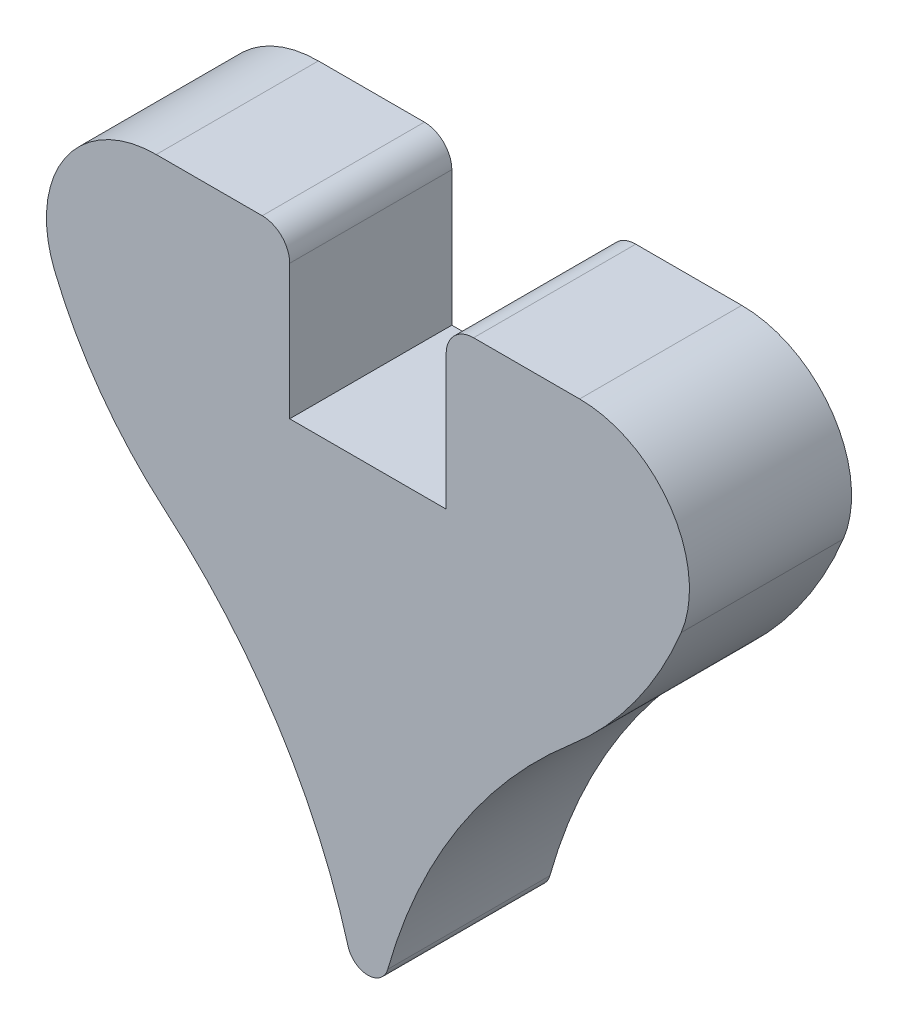
ISO-10303-21;
HEADER;
FILE_DESCRIPTION(('STEP AP214'),'2;1');
FILE_NAME('part.step','',(''),(''),'','','');
FILE_SCHEMA(('AUTOMOTIVE_DESIGN { 1 0 10303 214 1 1 1 1 }'));
ENDSEC;
DATA;
#1=APPLICATION_CONTEXT('core data for automotive mechanical design processes');
#2=APPLICATION_PROTOCOL_DEFINITION('international standard','automotive_design',2000,#1);
#3=PRODUCT_CONTEXT('',#1,'mechanical');
#4=PRODUCT('Part','Part','',(#3));
#5=PRODUCT_RELATED_PRODUCT_CATEGORY('part','',(#4));
#6=PRODUCT_DEFINITION_FORMATION('','',#4);
#7=PRODUCT_DEFINITION_CONTEXT('part definition',#1,'design');
#8=PRODUCT_DEFINITION('design','',#6,#7);
#9=PRODUCT_DEFINITION_SHAPE('','',#8);
#10=(LENGTH_UNIT() NAMED_UNIT(*) SI_UNIT(.MILLI.,.METRE.));
#11=(NAMED_UNIT(*) PLANE_ANGLE_UNIT() SI_UNIT($,.RADIAN.));
#12=(NAMED_UNIT(*) SI_UNIT($,.STERADIAN.) SOLID_ANGLE_UNIT());
#13=UNCERTAINTY_MEASURE_WITH_UNIT(LENGTH_MEASURE(1.E-05),#10,'distance_accuracy_value','');
#14=(GEOMETRIC_REPRESENTATION_CONTEXT(3) GLOBAL_UNCERTAINTY_ASSIGNED_CONTEXT((#13)) GLOBAL_UNIT_ASSIGNED_CONTEXT((#10,
#11,#12)) REPRESENTATION_CONTEXT('',''));
#15=CARTESIAN_POINT('',(0.,0.,0.));
#16=DIRECTION('',(0.,0.,1.));
#17=DIRECTION('',(1.,0.,0.));
#18=AXIS2_PLACEMENT_3D('',#15,#16,#17);
#19=CARTESIAN_POINT('',(-1.03061687101163,3.52972117310504,3.));
#20=DIRECTION('',(0.,0.,-1.));
#21=DIRECTION('',(-1.,0.,0.));
#22=AXIS2_PLACEMENT_3D('',#19,#20,#21);
#23=CYLINDRICAL_SURFACE('',#22,7.38061687101163);
#24=CARTESIAN_POINT('',(-1.03061687101163,3.52972117310504,0.));
#25=DIRECTION('',(0.,0.,1.));
#26=DIRECTION('',(1.,0.,0.));
#27=AXIS2_PLACEMENT_3D('',#24,#25,#26);
#28=CIRCLE('',#27,7.38061687101163);
#29=CARTESIAN_POINT('',(5.79662289840147,0.725741407199869,0.));
#30=VERTEX_POINT('',#29);
#31=CARTESIAN_POINT('',(3.75632103843788,-2.08799463029198,0.));
#32=VERTEX_POINT('',#31);
#33=EDGE_CURVE('E181',#30,#32,#28,.F.);
#34=ORIENTED_EDGE('',*,*,#33,.F.);
#35=DIRECTION('',(0.,0.,-1.));
#36=VECTOR('',#35,1.);
#37=CARTESIAN_POINT('',(5.79662289840147,0.725741407199869,3.));
#38=LINE('',#37,#36);
#39=CARTESIAN_POINT('',(5.79662289840147,0.725741407199869,3.));
#40=VERTEX_POINT('',#39);
#41=EDGE_CURVE('E234',#30,#40,#38,.F.);
#42=ORIENTED_EDGE('',*,*,#41,.T.);
#43=CARTESIAN_POINT('',(-1.03061687101163,3.52972117310504,3.));
#44=DIRECTION('',(0.,0.,1.));
#45=DIRECTION('',(1.,0.,0.));
#46=AXIS2_PLACEMENT_3D('',#43,#44,#45);
#47=CIRCLE('',#46,7.38061687101163);
#48=CARTESIAN_POINT('',(3.75632103843788,-2.08799463029198,3.));
#49=VERTEX_POINT('',#48);
#50=EDGE_CURVE('E201',#40,#49,#47,.F.);
#51=ORIENTED_EDGE('',*,*,#50,.T.);
#52=DIRECTION('',(0.,0.,-1.));
#53=VECTOR('',#52,1.);
#54=CARTESIAN_POINT('',(3.75632103843788,-2.08799463029198,3.));
#55=LINE('',#54,#53);
#56=EDGE_CURVE('E185',#49,#32,#55,.T.);
#57=ORIENTED_EDGE('',*,*,#56,.T.);
#58=EDGE_LOOP('',(#34,#42,#51,#57));
#59=FACE_BOUND('',#58,.T.);
#60=ADVANCED_FACE('F41',(#59),#23,.T.);
#61=CARTESIAN_POINT('',(0.,3.52972117310504,3.));
#62=DIRECTION('',(0.,1.,0.));
#63=DIRECTION('',(-1.,0.,0.));
#64=AXIS2_PLACEMENT_3D('',#61,#62,#63);
#65=PLANE('',#64);
#66=DIRECTION('',(1.,0.,0.));
#67=VECTOR('',#66,1.);
#68=CARTESIAN_POINT('',(0.,3.52972117310504,0.));
#69=LINE('',#68,#67);
#70=CARTESIAN_POINT('',(1.9555,3.52972117310504,0.));
#71=VERTEX_POINT('',#70);
#72=CARTESIAN_POINT('',(3.91697632496459,3.52972117310504,0.));
#73=VERTEX_POINT('',#72);
#74=EDGE_CURVE('E183',#71,#73,#69,.T.);
#75=ORIENTED_EDGE('',*,*,#74,.F.);
#76=DIRECTION('',(0.,0.,-1.));
#77=VECTOR('',#76,1.);
#78=CARTESIAN_POINT('',(1.9555,3.52972117310504,3.));
#79=LINE('',#78,#77);
#80=CARTESIAN_POINT('',(1.9555,3.52972117310504,3.));
#81=VERTEX_POINT('',#80);
#82=EDGE_CURVE('E241',#71,#81,#79,.F.);
#83=ORIENTED_EDGE('',*,*,#82,.T.);
#84=DIRECTION('',(1.,0.,0.));
#85=VECTOR('',#84,1.);
#86=CARTESIAN_POINT('',(0.,3.52972117310504,3.));
#87=LINE('',#86,#85);
#88=CARTESIAN_POINT('',(3.91697632496459,3.52972117310504,3.));
#89=VERTEX_POINT('',#88);
#90=EDGE_CURVE('E163',#81,#89,#87,.T.);
#91=ORIENTED_EDGE('',*,*,#90,.T.);
#92=DIRECTION('',(0.,0.,-1.));
#93=VECTOR('',#92,1.);
#94=CARTESIAN_POINT('',(3.91697632496459,3.52972117310504,3.));
#95=LINE('',#94,#93);
#96=EDGE_CURVE('E235',#89,#73,#95,.T.);
#97=ORIENTED_EDGE('',*,*,#96,.T.);
#98=EDGE_LOOP('',(#75,#83,#91,#97));
#99=FACE_BOUND('',#98,.T.);
#100=ADVANCED_FACE('F289',(#99),#65,.T.);
#101=CARTESIAN_POINT('',(1.4475,0.,3.));
#102=DIRECTION('',(-1.,0.,0.));
#103=DIRECTION('',(0.,-1.,0.));
#104=AXIS2_PLACEMENT_3D('',#101,#102,#103);
#105=PLANE('',#104);
#106=DIRECTION('',(0.,1.,0.));
#107=VECTOR('',#106,1.);
#108=CARTESIAN_POINT('',(1.4475,0.,3.));
#109=LINE('',#108,#107);
#110=CARTESIAN_POINT('',(1.4475,0.529721173105039,3.));
#111=VERTEX_POINT('',#110);
#112=CARTESIAN_POINT('',(1.4475,3.02172117310504,3.));
#113=VERTEX_POINT('',#112);
#114=EDGE_CURVE('E150',#111,#113,#109,.T.);
#115=ORIENTED_EDGE('',*,*,#114,.T.);
#116=DIRECTION('',(0.,0.,-1.));
#117=VECTOR('',#116,1.);
#118=CARTESIAN_POINT('',(1.4475,3.02172117310504,3.));
#119=LINE('',#118,#117);
#120=CARTESIAN_POINT('',(1.4475,3.02172117310504,0.));
#121=VERTEX_POINT('',#120);
#122=EDGE_CURVE('E240',#113,#121,#119,.T.);
#123=ORIENTED_EDGE('',*,*,#122,.T.);
#124=DIRECTION('',(0.,1.,0.));
#125=VECTOR('',#124,1.);
#126=CARTESIAN_POINT('',(1.4475,0.,0.));
#127=LINE('',#126,#125);
#128=CARTESIAN_POINT('',(1.4475,0.529721173105039,0.));
#129=VERTEX_POINT('',#128);
#130=EDGE_CURVE('E147',#129,#121,#127,.T.);
#131=ORIENTED_EDGE('',*,*,#130,.F.);
#132=DIRECTION('',(0.,0.,-1.));
#133=VECTOR('',#132,1.);
#134=CARTESIAN_POINT('',(1.4475,0.529721173105039,3.));
#135=LINE('',#134,#133);
#136=EDGE_CURVE('E141',#111,#129,#135,.T.);
#137=ORIENTED_EDGE('',*,*,#136,.F.);
#138=EDGE_LOOP('',(#115,#123,#131,#137));
#139=FACE_BOUND('',#138,.T.);
#140=ADVANCED_FACE('F144',(#139),#105,.T.);
#141=CARTESIAN_POINT('',(0.,0.529721173105039,3.));
#142=DIRECTION('',(0.,1.,0.));
#143=DIRECTION('',(-1.,0.,0.));
#144=AXIS2_PLACEMENT_3D('',#141,#142,#143);
#145=PLANE('',#144);
#146=DIRECTION('',(1.,0.,0.));
#147=VECTOR('',#146,1.);
#148=CARTESIAN_POINT('',(0.,0.529721173105039,0.));
#149=LINE('',#148,#147);
#150=CARTESIAN_POINT('',(-1.4475,0.529721173105039,0.));
#151=VERTEX_POINT('',#150);
#152=EDGE_CURVE('E186',#151,#129,#149,.T.);
#153=ORIENTED_EDGE('',*,*,#152,.F.);
#154=DIRECTION('',(0.,0.,-1.));
#155=VECTOR('',#154,1.);
#156=CARTESIAN_POINT('',(-1.4475,0.529721173105039,3.));
#157=LINE('',#156,#155);
#158=CARTESIAN_POINT('',(-1.4475,0.529721173105039,3.));
#159=VERTEX_POINT('',#158);
#160=EDGE_CURVE('E156',#159,#151,#157,.T.);
#161=ORIENTED_EDGE('',*,*,#160,.F.);
#162=DIRECTION('',(1.,0.,0.));
#163=VECTOR('',#162,1.);
#164=CARTESIAN_POINT('',(0.,0.529721173105039,3.));
#165=LINE('',#164,#163);
#166=EDGE_CURVE('E161',#159,#111,#165,.T.);
#167=ORIENTED_EDGE('',*,*,#166,.T.);
#168=ORIENTED_EDGE('',*,*,#136,.T.);
#169=EDGE_LOOP('',(#153,#161,#167,#168));
#170=FACE_BOUND('',#169,.T.);
#171=ADVANCED_FACE('F167',(#170),#145,.T.);
#172=CARTESIAN_POINT('',(-1.4475,0.,3.));
#173=DIRECTION('',(-1.,0.,0.));
#174=DIRECTION('',(0.,-1.,0.));
#175=AXIS2_PLACEMENT_3D('',#172,#173,#174);
#176=PLANE('',#175);
#177=DIRECTION('',(0.,1.,0.));
#178=VECTOR('',#177,1.);
#179=CARTESIAN_POINT('',(-1.4475,0.,0.));
#180=LINE('',#179,#178);
#181=CARTESIAN_POINT('',(-1.4475,3.02172117310504,0.));
#182=VERTEX_POINT('',#181);
#183=EDGE_CURVE('E187',#151,#182,#180,.T.);
#184=ORIENTED_EDGE('',*,*,#183,.T.);
#185=DIRECTION('',(0.,0.,-1.));
#186=VECTOR('',#185,1.);
#187=CARTESIAN_POINT('',(-1.4475,3.02172117310504,3.));
#188=LINE('',#187,#186);
#189=CARTESIAN_POINT('',(-1.4475,3.02172117310504,3.));
#190=VERTEX_POINT('',#189);
#191=EDGE_CURVE('E11',#182,#190,#188,.F.);
#192=ORIENTED_EDGE('',*,*,#191,.T.);
#193=DIRECTION('',(0.,1.,0.));
#194=VECTOR('',#193,1.);
#195=CARTESIAN_POINT('',(-1.4475,0.,3.));
#196=LINE('',#195,#194);
#197=EDGE_CURVE('E170',#159,#190,#196,.T.);
#198=ORIENTED_EDGE('',*,*,#197,.F.);
#199=ORIENTED_EDGE('',*,*,#160,.T.);
#200=EDGE_LOOP('',(#184,#192,#198,#199));
#201=FACE_BOUND('',#200,.T.);
#202=ADVANCED_FACE('F294',(#201),#176,.F.);
#203=CARTESIAN_POINT('',(0.,3.52972117310504,3.));
#204=DIRECTION('',(0.,1.,0.));
#205=DIRECTION('',(-1.,0.,0.));
#206=AXIS2_PLACEMENT_3D('',#203,#204,#205);
#207=PLANE('',#206);
#208=DIRECTION('',(1.,0.,0.));
#209=VECTOR('',#208,1.);
#210=CARTESIAN_POINT('',(0.,3.52972117310504,3.));
#211=LINE('',#210,#209);
#212=CARTESIAN_POINT('',(-3.91697632496459,3.52972117310504,3.));
#213=VERTEX_POINT('',#212);
#214=CARTESIAN_POINT('',(-1.9555,3.52972117310504,3.));
#215=VERTEX_POINT('',#214);
#216=EDGE_CURVE('E166',#213,#215,#211,.T.);
#217=ORIENTED_EDGE('',*,*,#216,.T.);
#218=DIRECTION('',(0.,0.,-1.));
#219=VECTOR('',#218,1.);
#220=CARTESIAN_POINT('',(-1.9555,3.52972117310504,0.));
#221=LINE('',#220,#219);
#222=CARTESIAN_POINT('',(-1.9555,3.52972117310504,0.));
#223=VERTEX_POINT('',#222);
#224=EDGE_CURVE('E47',#215,#223,#221,.T.);
#225=ORIENTED_EDGE('',*,*,#224,.T.);
#226=DIRECTION('',(1.,0.,0.));
#227=VECTOR('',#226,1.);
#228=CARTESIAN_POINT('',(0.,3.52972117310504,0.));
#229=LINE('',#228,#227);
#230=CARTESIAN_POINT('',(-3.91697632496459,3.52972117310504,0.));
#231=VERTEX_POINT('',#230);
#232=EDGE_CURVE('E195',#231,#223,#229,.T.);
#233=ORIENTED_EDGE('',*,*,#232,.F.);
#234=DIRECTION('',(0.,0.,1.));
#235=VECTOR('',#234,1.);
#236=CARTESIAN_POINT('',(-3.91697632496459,3.52972117310504,3.));
#237=LINE('',#236,#235);
#238=EDGE_CURVE('E223',#231,#213,#237,.T.);
#239=ORIENTED_EDGE('',*,*,#238,.T.);
#240=EDGE_LOOP('',(#217,#225,#233,#239));
#241=FACE_BOUND('',#240,.T.);
#242=ADVANCED_FACE('F249',(#241),#207,.T.);
#243=CARTESIAN_POINT('',(1.03061687101163,3.52972117310504,3.));
#244=DIRECTION('',(0.,0.,-1.));
#245=DIRECTION('',(-1.,0.,0.));
#246=AXIS2_PLACEMENT_3D('',#243,#244,#245);
#247=CYLINDRICAL_SURFACE('',#246,7.38061687101163);
#248=CARTESIAN_POINT('',(1.03061687101163,3.52972117310504,3.));
#249=DIRECTION('',(0.,0.,1.));
#250=DIRECTION('',(1.,0.,0.));
#251=AXIS2_PLACEMENT_3D('',#248,#249,#250);
#252=CIRCLE('',#251,7.38061687101163);
#253=CARTESIAN_POINT('',(-5.79662289840147,0.725741407199868,3.));
#254=VERTEX_POINT('',#253);
#255=CARTESIAN_POINT('',(-3.75632103843788,-2.08799463029198,3.));
#256=VERTEX_POINT('',#255);
#257=EDGE_CURVE('E174',#254,#256,#252,.T.);
#258=ORIENTED_EDGE('',*,*,#257,.F.);
#259=DIRECTION('',(0.,0.,-1.));
#260=VECTOR('',#259,1.);
#261=CARTESIAN_POINT('',(-5.79662289840147,0.725741407199868,3.));
#262=LINE('',#261,#260);
#263=CARTESIAN_POINT('',(-5.79662289840147,0.725741407199868,0.));
#264=VERTEX_POINT('',#263);
#265=EDGE_CURVE('E217',#254,#264,#262,.T.);
#266=ORIENTED_EDGE('',*,*,#265,.T.);
#267=CARTESIAN_POINT('',(1.03061687101163,3.52972117310504,0.));
#268=DIRECTION('',(0.,0.,1.));
#269=DIRECTION('',(1.,0.,0.));
#270=AXIS2_PLACEMENT_3D('',#267,#268,#269);
#271=CIRCLE('',#270,7.38061687101163);
#272=CARTESIAN_POINT('',(-3.75632103843788,-2.08799463029198,0.));
#273=VERTEX_POINT('',#272);
#274=EDGE_CURVE('E194',#264,#273,#271,.T.);
#275=ORIENTED_EDGE('',*,*,#274,.T.);
#276=DIRECTION('',(0.,0.,-1.));
#277=VECTOR('',#276,1.);
#278=CARTESIAN_POINT('',(-3.75632103843788,-2.08799463029198,3.));
#279=LINE('',#278,#277);
#280=EDGE_CURVE('E206',#256,#273,#279,.T.);
#281=ORIENTED_EDGE('',*,*,#280,.F.);
#282=EDGE_LOOP('',(#258,#266,#275,#281));
#283=FACE_BOUND('',#282,.T.);
#284=ADVANCED_FACE('F262',(#283),#247,.T.);
#285=CARTESIAN_POINT('',(-10.7515301939788,-10.2972293779533,3.));
#286=DIRECTION('',(0.,0.,-1.));
#287=DIRECTION('',(-1.,0.,0.));
#288=AXIS2_PLACEMENT_3D('',#285,#286,#287);
#289=CYLINDRICAL_SURFACE('',#288,10.7853829914368);
#290=CARTESIAN_POINT('',(-10.7515301939788,-10.2972293779533,0.));
#291=DIRECTION('',(0.,0.,1.));
#292=DIRECTION('',(1.,0.,0.));
#293=AXIS2_PLACEMENT_3D('',#290,#291,#292);
#294=CIRCLE('',#293,10.7853829914368);
#295=CARTESIAN_POINT('',(-0.366845110636749,-7.38470435801162,0.));
#296=VERTEX_POINT('',#295);
#297=EDGE_CURVE('E197',#273,#296,#294,.F.);
#298=ORIENTED_EDGE('',*,*,#297,.T.);
#299=DIRECTION('',(0.,0.,-1.));
#300=VECTOR('',#299,1.);
#301=CARTESIAN_POINT('',(-0.366845110636747,-7.38470435801162,3.));
#302=LINE('',#301,#300);
#303=CARTESIAN_POINT('',(-0.366845110636749,-7.38470435801162,3.));
#304=VERTEX_POINT('',#303);
#305=EDGE_CURVE('E212',#296,#304,#302,.F.);
#306=ORIENTED_EDGE('',*,*,#305,.T.);
#307=CARTESIAN_POINT('',(-10.7515301939788,-10.2972293779533,3.));
#308=DIRECTION('',(0.,0.,1.));
#309=DIRECTION('',(1.,0.,0.));
#310=AXIS2_PLACEMENT_3D('',#307,#308,#309);
#311=CIRCLE('',#310,10.7853829914368);
#312=EDGE_CURVE('E176',#256,#304,#311,.F.);
#313=ORIENTED_EDGE('',*,*,#312,.F.);
#314=ORIENTED_EDGE('',*,*,#280,.T.);
#315=EDGE_LOOP('',(#298,#306,#313,#314));
#316=FACE_BOUND('',#315,.T.);
#317=ADVANCED_FACE('F389',(#316),#289,.F.);
#318=CARTESIAN_POINT('',(10.7515301939788,-10.2972293779533,3.));
#319=DIRECTION('',(0.,0.,-1.));
#320=DIRECTION('',(-1.,0.,0.));
#321=AXIS2_PLACEMENT_3D('',#318,#319,#320);
#322=CYLINDRICAL_SURFACE('',#321,10.7853829914368);
#323=CARTESIAN_POINT('',(10.7515301939788,-10.2972293779533,3.));
#324=DIRECTION('',(0.,0.,1.));
#325=DIRECTION('',(1.,0.,0.));
#326=AXIS2_PLACEMENT_3D('',#323,#324,#325);
#327=CIRCLE('',#326,10.7853829914368);
#328=CARTESIAN_POINT('',(0.366845110636749,-7.38470435801162,3.));
#329=VERTEX_POINT('',#328);
#330=EDGE_CURVE('E178',#49,#329,#327,.T.);
#331=ORIENTED_EDGE('',*,*,#330,.T.);
#332=DIRECTION('',(0.,0.,-1.));
#333=VECTOR('',#332,1.);
#334=CARTESIAN_POINT('',(0.366845110636747,-7.38470435801162,3.));
#335=LINE('',#334,#333);
#336=CARTESIAN_POINT('',(0.366845110636749,-7.38470435801162,0.));
#337=VERTEX_POINT('',#336);
#338=EDGE_CURVE('E154',#329,#337,#335,.T.);
#339=ORIENTED_EDGE('',*,*,#338,.T.);
#340=CARTESIAN_POINT('',(10.7515301939788,-10.2972293779533,0.));
#341=DIRECTION('',(0.,0.,1.));
#342=DIRECTION('',(1.,0.,0.));
#343=AXIS2_PLACEMENT_3D('',#340,#341,#342);
#344=CIRCLE('',#343,10.7853829914368);
#345=EDGE_CURVE('E199',#32,#337,#344,.T.);
#346=ORIENTED_EDGE('',*,*,#345,.F.);
#347=ORIENTED_EDGE('',*,*,#56,.F.);
#348=EDGE_LOOP('',(#331,#339,#346,#347));
#349=FACE_BOUND('',#348,.T.);
#350=ADVANCED_FACE('F277',(#349),#322,.F.);
#351=CARTESIAN_POINT('',(0.,0.,3.));
#352=DIRECTION('',(0.,0.,1.));
#353=DIRECTION('',(1.,0.,0.));
#354=AXIS2_PLACEMENT_3D('',#351,#352,#353);
#355=PLANE('',#354);
#356=ORIENTED_EDGE('',*,*,#90,.F.);
#357=CARTESIAN_POINT('',(1.9555,3.02172117310504,3.));
#358=DIRECTION('',(0.,0.,1.));
#359=DIRECTION('',(1.,0.,0.));
#360=AXIS2_PLACEMENT_3D('',#357,#358,#359);
#361=CIRCLE('',#360,0.508);
#362=EDGE_CURVE('E162',#81,#113,#361,.T.);
#363=ORIENTED_EDGE('',*,*,#362,.T.);
#364=ORIENTED_EDGE('',*,*,#114,.F.);
#365=ORIENTED_EDGE('',*,*,#166,.F.);
#366=ORIENTED_EDGE('',*,*,#197,.T.);
#367=CARTESIAN_POINT('',(-1.9555,3.02172117310504,3.));
#368=DIRECTION('',(0.,0.,1.));
#369=DIRECTION('',(1.,0.,0.));
#370=AXIS2_PLACEMENT_3D('',#367,#368,#369);
#371=CIRCLE('',#370,0.508);
#372=EDGE_CURVE('E63',#190,#215,#371,.T.);
#373=ORIENTED_EDGE('',*,*,#372,.T.);
#374=ORIENTED_EDGE('',*,*,#216,.F.);
#375=CARTESIAN_POINT('',(-3.91697632496459,1.49772117310504,3.));
#376=DIRECTION('',(0.,0.,1.));
#377=DIRECTION('',(1.,0.,0.));
#378=AXIS2_PLACEMENT_3D('',#375,#376,#377);
#379=CIRCLE('',#378,2.032);
#380=EDGE_CURVE('E227',#213,#254,#379,.T.);
#381=ORIENTED_EDGE('',*,*,#380,.T.);
#382=ORIENTED_EDGE('',*,*,#257,.T.);
#383=ORIENTED_EDGE('',*,*,#312,.T.);
#384=CARTESIAN_POINT('',(0.,-7.28181769803128,3.));
#385=DIRECTION('',(0.,0.,1.));
#386=DIRECTION('',(1.,0.,0.));
#387=AXIS2_PLACEMENT_3D('',#384,#385,#386);
#388=CIRCLE('',#387,0.381);
#389=EDGE_CURVE('E216',#304,#329,#388,.T.);
#390=ORIENTED_EDGE('',*,*,#389,.T.);
#391=ORIENTED_EDGE('',*,*,#330,.F.);
#392=ORIENTED_EDGE('',*,*,#50,.F.);
#393=CARTESIAN_POINT('',(3.91697632496459,1.49772117310504,3.));
#394=DIRECTION('',(0.,0.,1.));
#395=DIRECTION('',(1.,0.,0.));
#396=AXIS2_PLACEMENT_3D('',#393,#394,#395);
#397=CIRCLE('',#396,2.032);
#398=EDGE_CURVE('E230',#40,#89,#397,.T.);
#399=ORIENTED_EDGE('',*,*,#398,.T.);
#400=EDGE_LOOP('',(#356,#363,#364,#365,#366,#373,#374,#381,#382,#383,#390,#391,#392,#399));
#401=FACE_BOUND('',#400,.T.);
#402=ADVANCED_FACE('F159',(#401),#355,.T.);
#403=CARTESIAN_POINT('',(0.,0.,0.));
#404=DIRECTION('',(0.,0.,1.));
#405=DIRECTION('',(1.,0.,0.));
#406=AXIS2_PLACEMENT_3D('',#403,#404,#405);
#407=PLANE('',#406);
#408=ORIENTED_EDGE('',*,*,#130,.T.);
#409=CARTESIAN_POINT('',(1.9555,3.02172117310504,0.));
#410=DIRECTION('',(0.,0.,1.));
#411=DIRECTION('',(1.,0.,0.));
#412=AXIS2_PLACEMENT_3D('',#409,#410,#411);
#413=CIRCLE('',#412,0.508);
#414=EDGE_CURVE('E243',#121,#71,#413,.F.);
#415=ORIENTED_EDGE('',*,*,#414,.T.);
#416=ORIENTED_EDGE('',*,*,#74,.T.);
#417=CARTESIAN_POINT('',(3.91697632496459,1.49772117310504,0.));
#418=DIRECTION('',(0.,0.,1.));
#419=DIRECTION('',(1.,0.,0.));
#420=AXIS2_PLACEMENT_3D('',#417,#418,#419);
#421=CIRCLE('',#420,2.032);
#422=EDGE_CURVE('E222',#73,#30,#421,.F.);
#423=ORIENTED_EDGE('',*,*,#422,.T.);
#424=ORIENTED_EDGE('',*,*,#33,.T.);
#425=ORIENTED_EDGE('',*,*,#345,.T.);
#426=CARTESIAN_POINT('',(0.,-7.28181769803128,0.));
#427=DIRECTION('',(0.,0.,1.));
#428=DIRECTION('',(1.,0.,0.));
#429=AXIS2_PLACEMENT_3D('',#426,#427,#428);
#430=CIRCLE('',#429,0.381);
#431=EDGE_CURVE('E215',#337,#296,#430,.F.);
#432=ORIENTED_EDGE('',*,*,#431,.T.);
#433=ORIENTED_EDGE('',*,*,#297,.F.);
#434=ORIENTED_EDGE('',*,*,#274,.F.);
#435=CARTESIAN_POINT('',(-3.91697632496459,1.49772117310504,0.));
#436=DIRECTION('',(0.,0.,1.));
#437=DIRECTION('',(1.,0.,0.));
#438=AXIS2_PLACEMENT_3D('',#435,#436,#437);
#439=CIRCLE('',#438,2.032);
#440=EDGE_CURVE('E224',#264,#231,#439,.F.);
#441=ORIENTED_EDGE('',*,*,#440,.T.);
#442=ORIENTED_EDGE('',*,*,#232,.T.);
#443=CARTESIAN_POINT('',(-1.9555,3.02172117310504,0.));
#444=DIRECTION('',(0.,0.,1.));
#445=DIRECTION('',(1.,0.,0.));
#446=AXIS2_PLACEMENT_3D('',#443,#444,#445);
#447=CIRCLE('',#446,0.508);
#448=EDGE_CURVE('E239',#223,#182,#447,.F.);
#449=ORIENTED_EDGE('',*,*,#448,.T.);
#450=ORIENTED_EDGE('',*,*,#183,.F.);
#451=ORIENTED_EDGE('',*,*,#152,.T.);
#452=EDGE_LOOP('',(#408,#415,#416,#423,#424,#425,#432,#433,#434,#441,#442,#449,#450,#451));
#453=FACE_BOUND('',#452,.T.);
#454=ADVANCED_FACE('F255',(#453),#407,.F.);
#455=CARTESIAN_POINT('',(0.,-7.28181769803128,3.));
#456=DIRECTION('',(0.,0.,-1.));
#457=DIRECTION('',(-1.,0.,0.));
#458=AXIS2_PLACEMENT_3D('',#455,#456,#457);
#459=CYLINDRICAL_SURFACE('',#458,0.381);
#460=ORIENTED_EDGE('',*,*,#389,.F.);
#461=ORIENTED_EDGE('',*,*,#305,.F.);
#462=ORIENTED_EDGE('',*,*,#431,.F.);
#463=ORIENTED_EDGE('',*,*,#338,.F.);
#464=EDGE_LOOP('',(#460,#461,#462,#463));
#465=FACE_BOUND('',#464,.T.);
#466=ADVANCED_FACE('F272',(#465),#459,.T.);
#467=CARTESIAN_POINT('',(-3.91697632496459,1.49772117310504,3.));
#468=DIRECTION('',(0.,0.,-1.));
#469=DIRECTION('',(-1.,0.,0.));
#470=AXIS2_PLACEMENT_3D('',#467,#468,#469);
#471=CYLINDRICAL_SURFACE('',#470,2.032);
#472=ORIENTED_EDGE('',*,*,#380,.F.);
#473=ORIENTED_EDGE('',*,*,#238,.F.);
#474=ORIENTED_EDGE('',*,*,#440,.F.);
#475=ORIENTED_EDGE('',*,*,#265,.F.);
#476=EDGE_LOOP('',(#472,#473,#474,#475));
#477=FACE_BOUND('',#476,.T.);
#478=ADVANCED_FACE('F261',(#477),#471,.T.);
#479=CARTESIAN_POINT('',(3.91697632496459,1.49772117310504,3.));
#480=DIRECTION('',(0.,0.,-1.));
#481=DIRECTION('',(-1.,0.,0.));
#482=AXIS2_PLACEMENT_3D('',#479,#480,#481);
#483=CYLINDRICAL_SURFACE('',#482,2.032);
#484=ORIENTED_EDGE('',*,*,#398,.F.);
#485=ORIENTED_EDGE('',*,*,#41,.F.);
#486=ORIENTED_EDGE('',*,*,#422,.F.);
#487=ORIENTED_EDGE('',*,*,#96,.F.);
#488=EDGE_LOOP('',(#484,#485,#486,#487));
#489=FACE_BOUND('',#488,.T.);
#490=ADVANCED_FACE('F290',(#489),#483,.T.);
#491=CARTESIAN_POINT('',(1.9555,3.02172117310504,3.));
#492=DIRECTION('',(0.,0.,-1.));
#493=DIRECTION('',(-1.,0.,0.));
#494=AXIS2_PLACEMENT_3D('',#491,#492,#493);
#495=CYLINDRICAL_SURFACE('',#494,0.508);
#496=ORIENTED_EDGE('',*,*,#362,.F.);
#497=ORIENTED_EDGE('',*,*,#82,.F.);
#498=ORIENTED_EDGE('',*,*,#414,.F.);
#499=ORIENTED_EDGE('',*,*,#122,.F.);
#500=EDGE_LOOP('',(#496,#497,#498,#499));
#501=FACE_BOUND('',#500,.T.);
#502=ADVANCED_FACE('F291',(#501),#495,.T.);
#503=CARTESIAN_POINT('',(-1.9555,3.02172117310504,3.));
#504=DIRECTION('',(0.,0.,1.));
#505=DIRECTION('',(1.,0.,0.));
#506=AXIS2_PLACEMENT_3D('',#503,#504,#505);
#507=CYLINDRICAL_SURFACE('',#506,0.508);
#508=ORIENTED_EDGE('',*,*,#372,.F.);
#509=ORIENTED_EDGE('',*,*,#191,.F.);
#510=ORIENTED_EDGE('',*,*,#448,.F.);
#511=ORIENTED_EDGE('',*,*,#224,.F.);
#512=EDGE_LOOP('',(#508,#509,#510,#511));
#513=FACE_BOUND('',#512,.T.);
#514=ADVANCED_FACE('F43',(#513),#507,.T.);
#515=CLOSED_SHELL('',(#60,#100,#140,#171,#202,#242,#284,#317,#350,#402,#454,#466,#478,#490,#502,#514));
#516=MANIFOLD_SOLID_BREP('B2',#515);
#517=ADVANCED_BREP_SHAPE_REPRESENTATION('',(#18,#516),#14);
#518=SHAPE_DEFINITION_REPRESENTATION(#9,#517);
ENDSEC;
END-ISO-10303-21;
